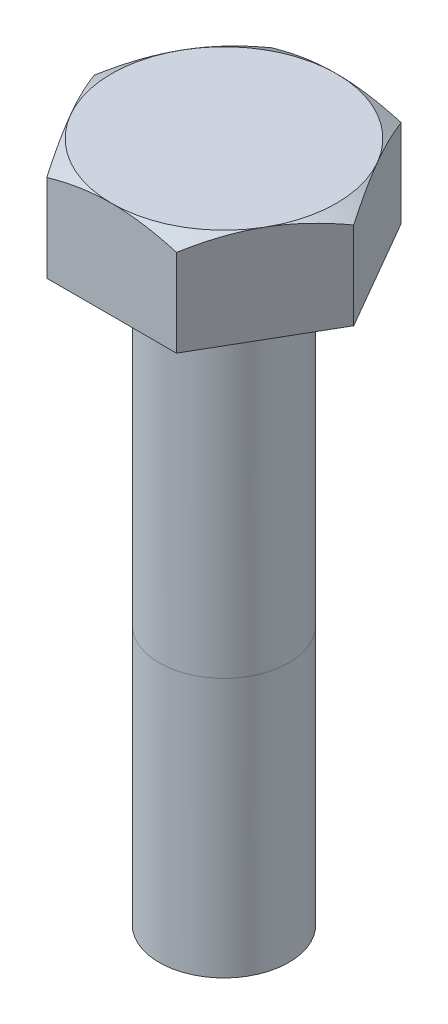
ISO-10303-21;
HEADER;
FILE_DESCRIPTION(('STEP AP214'),'2;1');
FILE_NAME('part.step','',(''),(''),'','','');
FILE_SCHEMA(('AUTOMOTIVE_DESIGN { 1 0 10303 214 1 1 1 1 }'));
ENDSEC;
DATA;
#1=APPLICATION_CONTEXT('core data for automotive mechanical design processes');
#2=APPLICATION_PROTOCOL_DEFINITION('international standard','automotive_design',2000,#1);
#3=PRODUCT_CONTEXT('',#1,'mechanical');
#4=PRODUCT('Part','Part','',(#3));
#5=PRODUCT_RELATED_PRODUCT_CATEGORY('part','',(#4));
#6=PRODUCT_DEFINITION_FORMATION('','',#4);
#7=PRODUCT_DEFINITION_CONTEXT('part definition',#1,'design');
#8=PRODUCT_DEFINITION('design','',#6,#7);
#9=PRODUCT_DEFINITION_SHAPE('','',#8);
#10=(LENGTH_UNIT() NAMED_UNIT(*) SI_UNIT(.MILLI.,.METRE.));
#11=(NAMED_UNIT(*) PLANE_ANGLE_UNIT() SI_UNIT($,.RADIAN.));
#12=(NAMED_UNIT(*) SI_UNIT($,.STERADIAN.) SOLID_ANGLE_UNIT());
#13=UNCERTAINTY_MEASURE_WITH_UNIT(LENGTH_MEASURE(1.E-05),#10,'distance_accuracy_value','');
#14=(GEOMETRIC_REPRESENTATION_CONTEXT(3) GLOBAL_UNCERTAINTY_ASSIGNED_CONTEXT((#13)) GLOBAL_UNIT_ASSIGNED_CONTEXT((#10,
#11,#12)) REPRESENTATION_CONTEXT('',''));
#15=CARTESIAN_POINT('',(0.,0.,0.));
#16=DIRECTION('',(0.,0.,1.));
#17=DIRECTION('',(1.,0.,0.));
#18=AXIS2_PLACEMENT_3D('',#15,#16,#17);
#19=CARTESIAN_POINT('',(0.,-90.,0.));
#20=DIRECTION('',(0.,1.,0.));
#21=DIRECTION('',(0.,0.,1.));
#22=AXIS2_PLACEMENT_3D('',#19,#20,#21);
#23=CYLINDRICAL_SURFACE('',#22,10.);
#24=CARTESIAN_POINT('',(0.,-90.,0.));
#25=DIRECTION('',(0.,-1.,0.));
#26=DIRECTION('',(0.,0.,-1.));
#27=AXIS2_PLACEMENT_3D('',#24,#25,#26);
#28=CIRCLE('',#27,10.);
#29=CARTESIAN_POINT('',(0.,-90.,-10.));
#30=VERTEX_POINT('',#29);
#31=EDGE_CURVE('E266',#30,#30,#28,.T.);
#32=ORIENTED_EDGE('',*,*,#31,.F.);
#33=EDGE_LOOP('',(#32));
#34=FACE_BOUND('',#33,.T.);
#35=CARTESIAN_POINT('',(0.,-50.,0.));
#36=DIRECTION('',(0.,1.,0.));
#37=DIRECTION('',(0.,0.,1.));
#38=AXIS2_PLACEMENT_3D('',#35,#36,#37);
#39=CIRCLE('',#38,10.);
#40=CARTESIAN_POINT('',(0.,-50.,10.));
#41=VERTEX_POINT('',#40);
#42=CARTESIAN_POINT('',(0.,-50.,-10.));
#43=VERTEX_POINT('',#42);
#44=EDGE_CURVE('E12',#41,#43,#39,.T.);
#45=ORIENTED_EDGE('',*,*,#44,.F.);
#46=EDGE_CURVE('E59',#43,#41,#39,.T.);
#47=ORIENTED_EDGE('',*,*,#46,.F.);
#48=EDGE_LOOP('',(#45,#47));
#49=FACE_BOUND('',#48,.T.);
#50=ADVANCED_FACE('F54',(#34,#49),#23,.T.);
#51=CARTESIAN_POINT('',(-10.,15.,17.3205080756888));
#52=DIRECTION('',(0.,0.,-1.));
#53=DIRECTION('',(-1.,0.,0.));
#54=AXIS2_PLACEMENT_3D('',#51,#52,#53);
#55=PLANE('',#54);
#56=CARTESIAN_POINT('',(-35.0002,2.45364774484949,17.3205080756888));
#57=CARTESIAN_POINT('',(-34.594137349599,2.66376511648012,17.3205080756888));
#58=CARTESIAN_POINT('',(-34.187782903959,2.87331841227193,17.3205080756888));
#59=CARTESIAN_POINT('',(-33.3744338694678,3.29118176038433,17.3205080756888));
#60=CARTESIAN_POINT('',(-32.9674392787615,3.49949180909377,17.3205080756888));
#61=CARTESIAN_POINT('',(-31.7453787417217,4.12240059131,17.3205080756888));
#62=CARTESIAN_POINT('',(-30.9292711669501,4.53495975451478,17.3205080756888));
#63=CARTESIAN_POINT('',(-29.2924702097003,5.35411848321641,17.3205080756888));
#64=CARTESIAN_POINT('',(-28.4717716511968,5.76070771838812,17.3205080756888));
#65=CARTESIAN_POINT('',(-26.8264017657733,6.56574726105629,17.3205080756888));
#66=CARTESIAN_POINT('',(-26.0017304995046,6.9641976923242,17.3205080756888));
#67=CARTESIAN_POINT('',(-24.3029908307602,7.77220294530385,17.3205080756888));
#68=CARTESIAN_POINT('',(-23.4286557376069,8.18119873425596,17.3205080756888));
#69=CARTESIAN_POINT('',(-21.6733855750682,8.98490551474932,17.3205080756888));
#70=CARTESIAN_POINT('',(-20.792450242979,9.37961593401695,17.3205080756888));
#71=CARTESIAN_POINT('',(-19.02295102819,10.1503650365485,17.3205080756888));
#72=CARTESIAN_POINT('',(-18.1343914849558,10.5264136090854,17.3205080756888));
#73=CARTESIAN_POINT('',(-16.79417061314,11.072276745268,17.3205080756888));
#74=CARTESIAN_POINT('',(-16.3462126010611,11.2511914561773,17.3205080756888));
#75=CARTESIAN_POINT('',(-15.4475674642222,11.6020195940876,17.3205080756888));
#76=CARTESIAN_POINT('',(-14.9968803941125,11.7739331607596,17.3205080756888));
#77=CARTESIAN_POINT('',(-14.0262783668963,12.1342982457444,17.3205080756888));
#78=CARTESIAN_POINT('',(-13.5058917294667,12.3214842972691,17.3205080756888));
#79=CARTESIAN_POINT('',(-12.4608100305044,12.6833855084323,17.3205080756888));
#80=CARTESIAN_POINT('',(-11.9361151665267,12.8581012363795,17.3205080756888));
#81=CARTESIAN_POINT('',(-10.881940858743,13.19289961425,17.3205080756888));
#82=CARTESIAN_POINT('',(-10.3524604922482,13.3529793731045,17.3205080756888));
#83=CARTESIAN_POINT('',(-9.28857134004602,13.6559344452437,17.3205080756888));
#84=CARTESIAN_POINT('',(-8.75416256248742,13.7988097869689,17.3205080756888));
#85=CARTESIAN_POINT('',(-7.69096618917046,14.0619176794332,17.3205080756888));
#86=CARTESIAN_POINT('',(-7.16227614867952,14.1825418275068,17.3205080756888));
#87=CARTESIAN_POINT('',(-6.10035716875704,14.40175176735,17.3205080756888));
#88=CARTESIAN_POINT('',(-5.5671286312236,14.5003394898638,17.3205080756888));
#89=CARTESIAN_POINT('',(-4.49688553377998,14.6727197767652,17.3205080756888));
#90=CARTESIAN_POINT('',(-3.95987277720629,14.7465234306242,17.3205080756888));
#91=CARTESIAN_POINT('',(-2.88279091983585,14.8670264413517,17.3205080756888));
#92=CARTESIAN_POINT('',(-2.34272186311566,14.9137261880997,17.3205080756888));
#93=CARTESIAN_POINT('',(-1.25267123056077,14.9788391289617,17.3205080756888));
#94=CARTESIAN_POINT('',(-0.702663140287673,14.9968144392807,17.3205080756888));
#95=CARTESIAN_POINT('',(0.39750822446066,15.0024095797508,17.3205080756888));
#96=CARTESIAN_POINT('',(0.947671498865498,14.9900294236495,17.3205080756888));
#97=CARTESIAN_POINT('',(2.04662194168171,14.935394673549,17.3205080756888));
#98=CARTESIAN_POINT('',(2.59540876468069,14.8931332126705,17.3205080756888));
#99=CARTESIAN_POINT('',(3.69004562597623,14.7803083239967,17.3205080756888));
#100=CARTESIAN_POINT('',(4.23589558916494,14.7097441758365,17.3205080756888));
#101=CARTESIAN_POINT('',(5.33479772199172,14.5409743216882,17.3205080756888));
#102=CARTESIAN_POINT('',(5.88776614189482,14.4422283712493,17.3205080756888));
#103=CARTESIAN_POINT('',(6.9888852153133,14.2207291115165,17.3205080756888));
#104=CARTESIAN_POINT('',(7.53703538726093,14.0979734304091,17.3205080756888));
#105=CARTESIAN_POINT('',(8.62832434164041,13.8315420945678,17.3205080756888));
#106=CARTESIAN_POINT('',(9.17146192722064,13.6878615743652,17.3205080756888));
#107=CARTESIAN_POINT('',(10.2526435291594,13.3825660151799,17.3205080756888));
#108=CARTESIAN_POINT('',(10.7906875240284,13.2209509005689,17.3205080756888));
#109=CARTESIAN_POINT('',(11.8578440716817,12.8837498967987,17.3205080756888));
#110=CARTESIAN_POINT('',(12.3869934445496,12.7082799323714,17.3205080756888));
#111=CARTESIAN_POINT('',(13.4408989961677,12.3445757559174,17.3205080756888));
#112=CARTESIAN_POINT('',(13.9656549531212,12.1563409037833,17.3205080756888));
#113=CARTESIAN_POINT('',(15.0112683729156,11.7690093049255,17.3205080756888));
#114=CARTESIAN_POINT('',(15.5321248992447,11.5699100384471,17.3205080756888));
#115=CARTESIAN_POINT('',(16.5702139767911,11.1625258281298,17.3205080756888));
#116=CARTESIAN_POINT('',(17.0874465851673,10.9542410295517,17.3205080756888));
#117=CARTESIAN_POINT('',(18.1193191268702,10.5295860637052,17.3205080756888));
#118=CARTESIAN_POINT('',(18.633955087633,10.3132062644857,17.3205080756888));
#119=CARTESIAN_POINT('',(19.6603532363293,9.87374262244933,17.3205080756888));
#120=CARTESIAN_POINT('',(20.1721154154588,9.65065875910729,17.3205080756888));
#121=CARTESIAN_POINT('',(21.1930219711227,9.19876826058183,17.3205080756888));
#122=CARTESIAN_POINT('',(21.7021666866254,8.96996239013087,17.3205080756888));
#123=CARTESIAN_POINT('',(22.7181974089433,8.50738526628483,17.3205080756888));
#124=CARTESIAN_POINT('',(23.2250833956179,8.27361396872093,17.3205080756888));
#125=CARTESIAN_POINT('',(24.6826194303235,7.59390796966616,17.3205080756888));
#126=CARTESIAN_POINT('',(25.630732791128,7.14253156179619,17.3205080756888));
#127=CARTESIAN_POINT('',(27.5213135261769,6.22806300245096,17.3205080756888));
#128=CARTESIAN_POINT('',(28.4637806901993,5.76497041806496,17.3205080756888));
#129=CARTESIAN_POINT('',(30.3407180245029,4.83126890722638,17.3205080756888));
#130=CARTESIAN_POINT('',(31.2752048003643,4.36069332298709,17.3205080756888));
#131=CARTESIAN_POINT('',(32.674099972078,3.64936975908292,17.3205080756888));
#132=CARTESIAN_POINT('',(33.1399056353817,3.41136235960626,17.3205080756888));
#133=CARTESIAN_POINT('',(34.070667933341,2.93369825038577,17.3205080756888));
#134=CARTESIAN_POINT('',(34.5356245719401,2.69404154832733,17.3205080756888));
#135=CARTESIAN_POINT('',(35.0002,2.45364774484949,17.3205080756888));
#136=B_SPLINE_CURVE_WITH_KNOTS('',3,(#56,#57,#58,#59,#60,#61,#62,#63,#64,#65,#66,#67,#68,#69,
#70,#71,#72,#73,#74,#75,#76,#77,#78,#79,#80,#81,#82,#83,#84,#85,#86,#87,#88,#89,#90,#91,#92,#93,
#94,#95,#96,#97,#98,#99,#100,#101,#102,#103,#104,#105,#106,#107,#108,#109,#110,#111,#112,#113,
#114,#115,#116,#117,#118,#119,#120,#121,#122,#123,#124,#125,#126,#127,#128,#129,#130,#131,#132,
#133,#134,#135),.UNSPECIFIED.,.F.,.F.,(4,2,2,2,2,2,2,2,2,2,2,2,2,2,2,2,2,2,2,2,2,2,2,2,2,2,2,2,
2,2,2,2,2,2,2,2,2,2,2,4),(0.,1.37161344579354,2.74323087365181,5.4865844470669,8.23422875979912,
10.9818312563728,13.8775275628596,16.7733397431781,19.6676006216986,21.1146507212927,
22.5616719384504,24.2206229328047,25.8794982756246,27.5387005942374,29.1979001699968,
30.8243176182081,32.4505925102536,34.0761387635025,35.7016616333065,37.3517358560537,
39.0018093315062,40.6522621257284,42.3027569302302,43.9873035112169,45.6720165851215,
47.3571220178305,49.042234556723,50.7144979923092,52.3868453472154,54.0595822274557,
55.7322926643706,57.4070609905288,59.0818344446946,60.7563852531483,62.43095096343,
65.5810612708419,68.7312881447791,71.8700925066505,73.4393579802908,75.0086161464313),.UNSPECIFIED.);
#137=CARTESIAN_POINT('',(-10.,13.4529946162075,17.3205080756888));
#138=VERTEX_POINT('',#137);
#139=CARTESIAN_POINT('',(0.,15.,17.3205080756888));
#140=VERTEX_POINT('',#139);
#141=EDGE_CURVE('E334',#138,#140,#136,.T.);
#142=ORIENTED_EDGE('',*,*,#141,.F.);
#143=DIRECTION('',(0.,-1.,0.));
#144=VECTOR('',#143,1.);
#145=CARTESIAN_POINT('',(-10.,15.,17.3205080756888));
#146=LINE('',#145,#144);
#147=CARTESIAN_POINT('',(-10.,0.,17.3205080756888));
#148=VERTEX_POINT('',#147);
#149=EDGE_CURVE('E290',#138,#148,#146,.T.);
#150=ORIENTED_EDGE('',*,*,#149,.T.);
#151=DIRECTION('',(1.,0.,0.));
#152=VECTOR('',#151,1.);
#153=CARTESIAN_POINT('',(-10.,0.,17.3205080756888));
#154=LINE('',#153,#152);
#155=CARTESIAN_POINT('',(10.,0.,17.3205080756888));
#156=VERTEX_POINT('',#155);
#157=EDGE_CURVE('E267',#148,#156,#154,.T.);
#158=ORIENTED_EDGE('',*,*,#157,.T.);
#159=DIRECTION('',(0.,-1.,0.));
#160=VECTOR('',#159,1.);
#161=CARTESIAN_POINT('',(10.,15.,17.3205080756888));
#162=LINE('',#161,#160);
#163=CARTESIAN_POINT('',(10.,13.4529946162075,17.3205080756888));
#164=VERTEX_POINT('',#163);
#165=EDGE_CURVE('E259',#164,#156,#162,.T.);
#166=ORIENTED_EDGE('',*,*,#165,.F.);
#167=EDGE_CURVE('E134',#140,#164,#136,.T.);
#168=ORIENTED_EDGE('',*,*,#167,.F.);
#169=EDGE_LOOP('',(#142,#150,#158,#166,#168));
#170=FACE_BOUND('',#169,.T.);
#171=ADVANCED_FACE('F56',(#170),#55,.F.);
#172=CARTESIAN_POINT('',(10.,15.,17.3205080756888));
#173=DIRECTION('',(-0.866025403784439,0.,-0.5));
#174=DIRECTION('',(-0.5,0.,0.866025403784439));
#175=AXIS2_PLACEMENT_3D('',#172,#173,#174);
#176=PLANE('',#175);
#177=CARTESIAN_POINT('',(9.99988452994616,13.4529279489635,17.3207080756888));
#178=CARTESIAN_POINT('',(10.2196804489893,13.5798185342334,16.9400103766098));
#179=CARTESIAN_POINT('',(10.4403336901135,13.7009510337884,16.5578277521278));
#180=CARTESIAN_POINT('',(10.8834095498801,13.930099316246,15.7903978514049));
#181=CARTESIAN_POINT('',(11.1058327249843,14.0381107850942,15.4051496113436));
#182=CARTESIAN_POINT('',(11.5528783285174,14.2395651135495,14.630843912724));
#183=CARTESIAN_POINT('',(11.7775046690377,14.3329735022134,14.2417796782245));
#184=CARTESIAN_POINT('',(12.2283181757897,14.5032158841818,13.4609477797918));
#185=CARTESIAN_POINT('',(12.4545052518665,14.5800508267049,13.0691802720113));
#186=CARTESIAN_POINT('',(12.9026445477568,14.7138783019843,12.2929802426613));
#187=CARTESIAN_POINT('',(13.1245634977723,14.7713137797107,11.908605346072));
#188=CARTESIAN_POINT('',(13.5694182641675,14.8676202170631,11.1380942886863));
#189=CARTESIAN_POINT('',(13.792354100037,14.9064908193503,10.7519580941326));
#190=CARTESIAN_POINT('',(14.238600264853,14.9646860457402,9.97903706398849));
#191=CARTESIAN_POINT('',(14.4619098314385,14.9840338963199,9.59225354884623));
#192=CARTESIAN_POINT('',(14.9087350891726,15.0027675315602,8.81832950034572));
#193=CARTESIAN_POINT('',(15.1322507737385,15.0021539330448,8.43118897838892));
#194=CARTESIAN_POINT('',(15.5501187845552,14.9823587382273,7.70742035279679));
#195=CARTESIAN_POINT('',(15.7445008833177,14.9655909890474,7.37074068165826));
#196=CARTESIAN_POINT('',(16.1328014051118,14.9172765485596,6.69818444930523));
#197=CARTESIAN_POINT('',(16.326719834744,14.885730068907,6.36230787665832));
#198=CARTESIAN_POINT('',(16.7140195476725,14.8084055580043,5.6914850961094));
#199=CARTESIAN_POINT('',(16.9074001850312,14.7626146571441,5.35654000700406));
#200=CARTESIAN_POINT('',(17.2932408832781,14.657609335493,4.68824431401259));
#201=CARTESIAN_POINT('',(17.4857009480636,14.5983949715832,4.35489370337606));
#202=CARTESIAN_POINT('',(18.0699383096197,14.3991106794132,3.34296490948102));
#203=CARTESIAN_POINT('',(18.4600237115261,14.2391695069504,2.66731717408817));
#204=CARTESIAN_POINT('',(19.2343779336769,13.8761686704497,1.32609631826738));
#205=CARTESIAN_POINT('',(19.6186566679131,13.6731942560017,0.660506026302148));
#206=CARTESIAN_POINT('',(20.0001154700538,13.4529279489635,-0.000200000000003042));
#207=B_SPLINE_CURVE_WITH_KNOTS('',3,(#177,#178,#179,#180,#181,#182,#183,#184,#185,#186,#187,
#188,#189,#190,#191,#192,#193,#194,#195,#196,#197,#198,#199,#200,#201,#202,#203,#204,#205,#206),
.UNSPECIFIED.,.F.,.F.,(4,2,2,2,2,2,2,2,2,2,2,2,2,2,4),(0.,1.3726537943407,2.74575768798322,
4.12205542001801,5.49827430578548,6.84052513875048,8.182801806464,9.52347966022142,
10.8641160860469,12.0312115970818,13.1982903939407,14.3664267057211,15.53455806769,
17.9222758503161,20.3053069971282),.UNSPECIFIED.);
#208=CARTESIAN_POINT('',(15.,15.,8.66025403784438));
#209=VERTEX_POINT('',#208);
#210=EDGE_CURVE('E127',#164,#209,#207,.T.);
#211=ORIENTED_EDGE('',*,*,#210,.F.);
#212=ORIENTED_EDGE('',*,*,#165,.T.);
#213=DIRECTION('',(0.5,0.,-0.866025403784439));
#214=VECTOR('',#213,1.);
#215=CARTESIAN_POINT('',(10.,0.,17.3205080756888));
#216=LINE('',#215,#214);
#217=CARTESIAN_POINT('',(20.,0.,0.));
#218=VERTEX_POINT('',#217);
#219=EDGE_CURVE('E271',#156,#218,#216,.T.);
#220=ORIENTED_EDGE('',*,*,#219,.T.);
#221=DIRECTION('',(0.,-1.,0.));
#222=VECTOR('',#221,1.);
#223=CARTESIAN_POINT('',(20.,15.,0.));
#224=LINE('',#223,#222);
#225=CARTESIAN_POINT('',(20.,13.4529946162075,0.));
#226=VERTEX_POINT('',#225);
#227=EDGE_CURVE('E163',#226,#218,#224,.T.);
#228=ORIENTED_EDGE('',*,*,#227,.F.);
#229=EDGE_CURVE('E139',#209,#226,#207,.T.);
#230=ORIENTED_EDGE('',*,*,#229,.F.);
#231=EDGE_LOOP('',(#211,#212,#220,#228,#230));
#232=FACE_BOUND('',#231,.T.);
#233=ADVANCED_FACE('F161',(#232),#176,.F.);
#234=CARTESIAN_POINT('',(20.,15.,0.));
#235=DIRECTION('',(-0.866025403784439,0.,0.5));
#236=DIRECTION('',(0.5,0.,0.866025403784439));
#237=AXIS2_PLACEMENT_3D('',#234,#235,#236);
#238=PLANE('',#237);
#239=CARTESIAN_POINT('',(20.0001154700538,13.4529279489635,0.000199999999995952));
#240=CARTESIAN_POINT('',(19.7803195510107,13.5798185342334,-0.380497699078995));
#241=CARTESIAN_POINT('',(19.5596663098865,13.7009510337884,-0.762680323560921));
#242=CARTESIAN_POINT('',(19.1165904501199,13.930099316246,-1.53011022428389));
#243=CARTESIAN_POINT('',(18.8941672750157,14.0381107850942,-1.91535846434513));
#244=CARTESIAN_POINT('',(18.4471216714826,14.2395651135495,-2.68966416296479));
#245=CARTESIAN_POINT('',(18.2224953309622,14.3329735022134,-3.07872839746427));
#246=CARTESIAN_POINT('',(17.7716818242103,14.5032158841818,-3.85956029589702));
#247=CARTESIAN_POINT('',(17.5454947481335,14.5800508267049,-4.2513278036775));
#248=CARTESIAN_POINT('',(17.0973554522432,14.7138783019843,-5.0275278330275));
#249=CARTESIAN_POINT('',(16.8754365022277,14.7713137797107,-5.41190272961675));
#250=CARTESIAN_POINT('',(16.4305817358325,14.8676202170631,-6.18241378700246));
#251=CARTESIAN_POINT('',(16.207645899963,14.9064908193503,-6.56854998155616));
#252=CARTESIAN_POINT('',(15.761399735147,14.9646860457402,-7.34147101170028));
#253=CARTESIAN_POINT('',(15.5380901685615,14.9840338963199,-7.72825452684254));
#254=CARTESIAN_POINT('',(15.0912649108274,15.0027675315602,-8.50217857534305));
#255=CARTESIAN_POINT('',(14.8677492262614,15.0021539330448,-8.88931909729985));
#256=CARTESIAN_POINT('',(14.4498812154448,14.9823587382273,-9.61308772289197));
#257=CARTESIAN_POINT('',(14.2554991166823,14.9655909890474,-9.94976739403051));
#258=CARTESIAN_POINT('',(13.8671985948881,14.9172765485596,-10.6223236263835));
#259=CARTESIAN_POINT('',(13.673280165256,14.885730068907,-10.9582001990304));
#260=CARTESIAN_POINT('',(13.2859804523275,14.8084055580043,-11.6290229795794));
#261=CARTESIAN_POINT('',(13.0925998149688,14.7626146571441,-11.9639680686847));
#262=CARTESIAN_POINT('',(12.7067591167219,14.657609335493,-12.6322637616762));
#263=CARTESIAN_POINT('',(12.5142990519364,14.5983949715832,-12.9656143723127));
#264=CARTESIAN_POINT('',(11.9300616903803,14.3991106794132,-13.9775431662077));
#265=CARTESIAN_POINT('',(11.5399762884739,14.2391695069504,-14.6531909016006));
#266=CARTESIAN_POINT('',(10.765622066323,13.8761686704497,-15.9944117574214));
#267=CARTESIAN_POINT('',(10.3813433320869,13.6731942560016,-16.6600020493866));
#268=CARTESIAN_POINT('',(9.99988452994616,13.4529279489635,-17.3207080756888));
#269=B_SPLINE_CURVE_WITH_KNOTS('',3,(#239,#240,#241,#242,#243,#244,#245,#246,#247,#248,#249,
#250,#251,#252,#253,#254,#255,#256,#257,#258,#259,#260,#261,#262,#263,#264,#265,#266,#267,#268),
.UNSPECIFIED.,.F.,.F.,(4,2,2,2,2,2,2,2,2,2,2,2,2,2,4),(0.,1.37265379434071,2.74575768798323,
4.12205542001802,5.49827430578548,6.84052513875048,8.182801806464,9.52347966022142,
10.8641160860469,12.0312115970818,13.1982903939407,14.3664267057211,15.53455806769,
17.9222758503161,20.3053069971282),.UNSPECIFIED.);
#270=CARTESIAN_POINT('',(15.,15.,-8.66025403784438));
#271=VERTEX_POINT('',#270);
#272=EDGE_CURVE('E146',#226,#271,#269,.T.);
#273=ORIENTED_EDGE('',*,*,#272,.F.);
#274=ORIENTED_EDGE('',*,*,#227,.T.);
#275=DIRECTION('',(-0.5,0.,-0.866025403784439));
#276=VECTOR('',#275,1.);
#277=CARTESIAN_POINT('',(20.,0.,0.));
#278=LINE('',#277,#276);
#279=CARTESIAN_POINT('',(10.,0.,-17.3205080756888));
#280=VERTEX_POINT('',#279);
#281=EDGE_CURVE('E274',#218,#280,#278,.T.);
#282=ORIENTED_EDGE('',*,*,#281,.T.);
#283=DIRECTION('',(0.,-1.,0.));
#284=VECTOR('',#283,1.);
#285=CARTESIAN_POINT('',(10.,15.,-17.3205080756888));
#286=LINE('',#285,#284);
#287=CARTESIAN_POINT('',(10.,13.4529946162075,-17.3205080756888));
#288=VERTEX_POINT('',#287);
#289=EDGE_CURVE('E299',#288,#280,#286,.T.);
#290=ORIENTED_EDGE('',*,*,#289,.F.);
#291=EDGE_CURVE('E166',#271,#288,#269,.T.);
#292=ORIENTED_EDGE('',*,*,#291,.F.);
#293=EDGE_LOOP('',(#273,#274,#282,#290,#292));
#294=FACE_BOUND('',#293,.T.);
#295=ADVANCED_FACE('F225',(#294),#238,.F.);
#296=CARTESIAN_POINT('',(10.,15.,-17.3205080756888));
#297=DIRECTION('',(0.,0.,1.));
#298=DIRECTION('',(1.,0.,0.));
#299=AXIS2_PLACEMENT_3D('',#296,#297,#298);
#300=PLANE('',#299);
#301=CARTESIAN_POINT('',(35.0002,2.45364774484949,-17.3205080756888));
#302=CARTESIAN_POINT('',(34.594137349599,2.66376511648011,-17.3205080756888));
#303=CARTESIAN_POINT('',(34.187782903959,2.87331841227192,-17.3205080756888));
#304=CARTESIAN_POINT('',(33.3744338694678,3.29118176038433,-17.3205080756888));
#305=CARTESIAN_POINT('',(32.9674392787615,3.49949180909377,-17.3205080756888));
#306=CARTESIAN_POINT('',(31.7453787417217,4.12240059131,-17.3205080756888));
#307=CARTESIAN_POINT('',(30.9292711669501,4.53495975451479,-17.3205080756888));
#308=CARTESIAN_POINT('',(29.2924702097003,5.35411848321641,-17.3205080756888));
#309=CARTESIAN_POINT('',(28.4717716511968,5.76070771838812,-17.3205080756888));
#310=CARTESIAN_POINT('',(26.8264017657733,6.56574726105629,-17.3205080756888));
#311=CARTESIAN_POINT('',(26.0017304995046,6.9641976923242,-17.3205080756888));
#312=CARTESIAN_POINT('',(24.3029908307602,7.77220294530385,-17.3205080756888));
#313=CARTESIAN_POINT('',(23.4286557376069,8.18119873425596,-17.3205080756888));
#314=CARTESIAN_POINT('',(21.6733855750682,8.98490551474932,-17.3205080756888));
#315=CARTESIAN_POINT('',(20.792450242979,9.37961593401695,-17.3205080756888));
#316=CARTESIAN_POINT('',(19.02295102819,10.1503650365485,-17.3205080756888));
#317=CARTESIAN_POINT('',(18.1343914849558,10.5264136090854,-17.3205080756888));
#318=CARTESIAN_POINT('',(16.79417061314,11.072276745268,-17.3205080756888));
#319=CARTESIAN_POINT('',(16.3462126010611,11.2511914561773,-17.3205080756888));
#320=CARTESIAN_POINT('',(15.4475674642222,11.6020195940876,-17.3205080756888));
#321=CARTESIAN_POINT('',(14.9968803941125,11.7739331607596,-17.3205080756888));
#322=CARTESIAN_POINT('',(14.0262783668963,12.1342982457444,-17.3205080756888));
#323=CARTESIAN_POINT('',(13.5058917294667,12.3214842972691,-17.3205080756888));
#324=CARTESIAN_POINT('',(12.4608100305044,12.6833855084323,-17.3205080756888));
#325=CARTESIAN_POINT('',(11.9361151665267,12.8581012363795,-17.3205080756888));
#326=CARTESIAN_POINT('',(10.881940858743,13.19289961425,-17.3205080756888));
#327=CARTESIAN_POINT('',(10.3524604922481,13.3529793731045,-17.3205080756888));
#328=CARTESIAN_POINT('',(9.28857134004601,13.6559344452437,-17.3205080756888));
#329=CARTESIAN_POINT('',(8.75416256248742,13.7988097869689,-17.3205080756888));
#330=CARTESIAN_POINT('',(7.69096618917046,14.0619176794332,-17.3205080756888));
#331=CARTESIAN_POINT('',(7.16227614867952,14.1825418275068,-17.3205080756888));
#332=CARTESIAN_POINT('',(6.10035716875704,14.40175176735,-17.3205080756888));
#333=CARTESIAN_POINT('',(5.5671286312236,14.5003394898638,-17.3205080756888));
#334=CARTESIAN_POINT('',(4.49688553377998,14.6727197767652,-17.3205080756888));
#335=CARTESIAN_POINT('',(3.95987277720629,14.7465234306242,-17.3205080756888));
#336=CARTESIAN_POINT('',(2.88279091983585,14.8670264413517,-17.3205080756888));
#337=CARTESIAN_POINT('',(2.34272186311566,14.9137261880997,-17.3205080756888));
#338=CARTESIAN_POINT('',(1.25267123056078,14.9788391289617,-17.3205080756888));
#339=CARTESIAN_POINT('',(0.702663140287677,14.9968144392807,-17.3205080756888));
#340=CARTESIAN_POINT('',(-0.397508224460655,15.0024095797508,-17.3205080756888));
#341=CARTESIAN_POINT('',(-0.947671498865495,14.9900294236495,-17.3205080756888));
#342=CARTESIAN_POINT('',(-2.04662194168171,14.935394673549,-17.3205080756888));
#343=CARTESIAN_POINT('',(-2.59540876468069,14.8931332126705,-17.3205080756888));
#344=CARTESIAN_POINT('',(-3.69004562597623,14.7803083239967,-17.3205080756888));
#345=CARTESIAN_POINT('',(-4.23589558916494,14.7097441758365,-17.3205080756888));
#346=CARTESIAN_POINT('',(-5.33479772199171,14.5409743216882,-17.3205080756888));
#347=CARTESIAN_POINT('',(-5.88776614189481,14.4422283712493,-17.3205080756888));
#348=CARTESIAN_POINT('',(-6.98888521531329,14.2207291115165,-17.3205080756888));
#349=CARTESIAN_POINT('',(-7.53703538726093,14.0979734304091,-17.3205080756888));
#350=CARTESIAN_POINT('',(-8.62832434164041,13.8315420945678,-17.3205080756888));
#351=CARTESIAN_POINT('',(-9.17146192722064,13.6878615743652,-17.3205080756888));
#352=CARTESIAN_POINT('',(-10.2526435291594,13.3825660151799,-17.3205080756888));
#353=CARTESIAN_POINT('',(-10.7906875240284,13.2209509005689,-17.3205080756888));
#354=CARTESIAN_POINT('',(-11.8578440716817,12.8837498967987,-17.3205080756888));
#355=CARTESIAN_POINT('',(-12.3869934445496,12.7082799323714,-17.3205080756888));
#356=CARTESIAN_POINT('',(-13.4408989961677,12.3445757559174,-17.3205080756888));
#357=CARTESIAN_POINT('',(-13.9656549531212,12.1563409037833,-17.3205080756888));
#358=CARTESIAN_POINT('',(-15.0112683729156,11.7690093049255,-17.3205080756888));
#359=CARTESIAN_POINT('',(-15.5321248992447,11.5699100384471,-17.3205080756888));
#360=CARTESIAN_POINT('',(-16.5702139767911,11.1625258281298,-17.3205080756888));
#361=CARTESIAN_POINT('',(-17.0874465851673,10.9542410295517,-17.3205080756888));
#362=CARTESIAN_POINT('',(-18.1193191268702,10.5295860637052,-17.3205080756888));
#363=CARTESIAN_POINT('',(-18.633955087633,10.3132062644857,-17.3205080756888));
#364=CARTESIAN_POINT('',(-19.6603532363293,9.87374262244933,-17.3205080756888));
#365=CARTESIAN_POINT('',(-20.1721154154588,9.65065875910728,-17.3205080756888));
#366=CARTESIAN_POINT('',(-21.1930219711227,9.19876826058182,-17.3205080756888));
#367=CARTESIAN_POINT('',(-21.7021666866254,8.96996239013086,-17.3205080756888));
#368=CARTESIAN_POINT('',(-22.7181974089433,8.50738526628483,-17.3205080756888));
#369=CARTESIAN_POINT('',(-23.2250833956179,8.27361396872093,-17.3205080756888));
#370=CARTESIAN_POINT('',(-24.6826194303235,7.59390796966615,-17.3205080756888));
#371=CARTESIAN_POINT('',(-25.630732791128,7.14253156179619,-17.3205080756888));
#372=CARTESIAN_POINT('',(-27.5213135261769,6.22806300245096,-17.3205080756888));
#373=CARTESIAN_POINT('',(-28.4637806901993,5.76497041806496,-17.3205080756888));
#374=CARTESIAN_POINT('',(-30.3407180245029,4.83126890722638,-17.3205080756888));
#375=CARTESIAN_POINT('',(-31.2752048003643,4.36069332298709,-17.3205080756888));
#376=CARTESIAN_POINT('',(-32.674099972078,3.64936975908292,-17.3205080756888));
#377=CARTESIAN_POINT('',(-33.1399056353817,3.41136235960626,-17.3205080756888));
#378=CARTESIAN_POINT('',(-34.070667933341,2.93369825038577,-17.3205080756888));
#379=CARTESIAN_POINT('',(-34.5356245719401,2.69404154832733,-17.3205080756888));
#380=CARTESIAN_POINT('',(-35.0002,2.45364774484949,-17.3205080756888));
#381=B_SPLINE_CURVE_WITH_KNOTS('',3,(#301,#302,#303,#304,#305,#306,#307,#308,#309,#310,#311,
#312,#313,#314,#315,#316,#317,#318,#319,#320,#321,#322,#323,#324,#325,#326,#327,#328,#329,#330,
#331,#332,#333,#334,#335,#336,#337,#338,#339,#340,#341,#342,#343,#344,#345,#346,#347,#348,#349,
#350,#351,#352,#353,#354,#355,#356,#357,#358,#359,#360,#361,#362,#363,#364,#365,#366,#367,#368,
#369,#370,#371,#372,#373,#374,#375,#376,#377,#378,#379,#380),.UNSPECIFIED.,.F.,.F.,(4,2,2,2,2,2,
2,2,2,2,2,2,2,2,2,2,2,2,2,2,2,2,2,2,2,2,2,2,2,2,2,2,2,2,2,2,2,2,2,4),(0.,1.37161344579354,
2.74323087365181,5.4865844470669,8.23422875979912,10.9818312563728,13.8775275628596,
16.7733397431781,19.6676006216986,21.1146507212927,22.5616719384504,24.2206229328047,
25.8794982756246,27.5387005942374,29.1979001699968,30.8243176182081,32.4505925102536,
34.0761387635025,35.7016616333065,37.3517358560537,39.0018093315062,40.6522621257284,
42.3027569302302,43.9873035112169,45.6720165851215,47.3571220178305,49.042234556723,
50.7144979923092,52.3868453472154,54.0595822274557,55.7322926643706,57.4070609905288,
59.0818344446946,60.7563852531483,62.43095096343,65.5810612708419,68.7312881447791,
71.8700925066505,73.4393579802908,75.0086161464313),.UNSPECIFIED.);
#382=CARTESIAN_POINT('',(0.,15.,-17.3205080756888));
#383=VERTEX_POINT('',#382);
#384=EDGE_CURVE('E219',#288,#383,#381,.T.);
#385=ORIENTED_EDGE('',*,*,#384,.F.);
#386=ORIENTED_EDGE('',*,*,#289,.T.);
#387=DIRECTION('',(-1.,0.,0.));
#388=VECTOR('',#387,1.);
#389=CARTESIAN_POINT('',(10.,0.,-17.3205080756888));
#390=LINE('',#389,#388);
#391=CARTESIAN_POINT('',(-10.,0.,-17.3205080756888));
#392=VERTEX_POINT('',#391);
#393=EDGE_CURVE('E278',#280,#392,#390,.T.);
#394=ORIENTED_EDGE('',*,*,#393,.T.);
#395=DIRECTION('',(0.,-1.,0.));
#396=VECTOR('',#395,1.);
#397=CARTESIAN_POINT('',(-10.,15.,-17.3205080756888));
#398=LINE('',#397,#396);
#399=CARTESIAN_POINT('',(-10.,13.4529946162075,-17.3205080756888));
#400=VERTEX_POINT('',#399);
#401=EDGE_CURVE('E296',#400,#392,#398,.T.);
#402=ORIENTED_EDGE('',*,*,#401,.F.);
#403=EDGE_CURVE('E212',#383,#400,#381,.T.);
#404=ORIENTED_EDGE('',*,*,#403,.F.);
#405=EDGE_LOOP('',(#385,#386,#394,#402,#404));
#406=FACE_BOUND('',#405,.T.);
#407=ADVANCED_FACE('F221',(#406),#300,.F.);
#408=CARTESIAN_POINT('',(-10.,15.,-17.3205080756888));
#409=DIRECTION('',(0.866025403784439,0.,0.5));
#410=DIRECTION('',(0.5,0.,-0.866025403784439));
#411=AXIS2_PLACEMENT_3D('',#408,#409,#410);
#412=PLANE('',#411);
#413=CARTESIAN_POINT('',(-9.99988452994616,13.4529279489635,-17.3207080756888));
#414=CARTESIAN_POINT('',(-10.2196804489893,13.5798185342334,-16.9400103766098));
#415=CARTESIAN_POINT('',(-10.4403336901135,13.7009510337884,-16.5578277521278));
#416=CARTESIAN_POINT('',(-10.8834095498801,13.930099316246,-15.7903978514049));
#417=CARTESIAN_POINT('',(-11.1058327249843,14.0381107850942,-15.4051496113436));
#418=CARTESIAN_POINT('',(-11.5528783285174,14.2395651135495,-14.630843912724));
#419=CARTESIAN_POINT('',(-11.7775046690377,14.3329735022134,-14.2417796782245));
#420=CARTESIAN_POINT('',(-12.2283181757897,14.5032158841818,-13.4609477797918));
#421=CARTESIAN_POINT('',(-12.4545052518665,14.5800508267048,-13.0691802720113));
#422=CARTESIAN_POINT('',(-12.9026445477568,14.7138783019843,-12.2929802426613));
#423=CARTESIAN_POINT('',(-13.1245634977723,14.7713137797107,-11.908605346072));
#424=CARTESIAN_POINT('',(-13.5694182641675,14.8676202170631,-11.1380942886863));
#425=CARTESIAN_POINT('',(-13.792354100037,14.9064908193503,-10.7519580941326));
#426=CARTESIAN_POINT('',(-14.238600264853,14.9646860457402,-9.97903706398849));
#427=CARTESIAN_POINT('',(-14.4619098314385,14.9840338963199,-9.59225354884623));
#428=CARTESIAN_POINT('',(-14.9087350891726,15.0027675315602,-8.81832950034572));
#429=CARTESIAN_POINT('',(-15.1322507737385,15.0021539330448,-8.43118897838892));
#430=CARTESIAN_POINT('',(-15.5501187845552,14.9823587382273,-7.70742035279679));
#431=CARTESIAN_POINT('',(-15.7445008833177,14.9655909890474,-7.37074068165826));
#432=CARTESIAN_POINT('',(-16.1328014051119,14.9172765485596,-6.69818444930524));
#433=CARTESIAN_POINT('',(-16.326719834744,14.885730068907,-6.36230787665832));
#434=CARTESIAN_POINT('',(-16.7140195476725,14.8084055580043,-5.6914850961094));
#435=CARTESIAN_POINT('',(-16.9074001850312,14.7626146571441,-5.35654000700407));
#436=CARTESIAN_POINT('',(-17.2932408832781,14.657609335493,-4.6882443140126));
#437=CARTESIAN_POINT('',(-17.4857009480636,14.5983949715832,-4.35489370337607));
#438=CARTESIAN_POINT('',(-18.0699383096197,14.3991106794132,-3.34296490948103));
#439=CARTESIAN_POINT('',(-18.4600237115261,14.2391695069504,-2.66731717408818));
#440=CARTESIAN_POINT('',(-19.2343779336769,13.8761686704497,-1.32609631826739));
#441=CARTESIAN_POINT('',(-19.6186566679131,13.6731942560017,-0.660506026302158));
#442=CARTESIAN_POINT('',(-20.0001154700538,13.4529279489635,0.000199999999992543));
#443=B_SPLINE_CURVE_WITH_KNOTS('',3,(#413,#414,#415,#416,#417,#418,#419,#420,#421,#422,#423,
#424,#425,#426,#427,#428,#429,#430,#431,#432,#433,#434,#435,#436,#437,#438,#439,#440,#441,#442),
.UNSPECIFIED.,.F.,.F.,(4,2,2,2,2,2,2,2,2,2,2,2,2,2,4),(0.,1.37265379434071,2.74575768798323,
4.12205542001802,5.49827430578548,6.84052513875048,8.182801806464,9.52347966022142,
10.8641160860469,12.0312115970818,13.1982903939407,14.3664267057211,15.53455806769,
17.9222758503161,20.3053069971282),.UNSPECIFIED.);
#444=CARTESIAN_POINT('',(-15.,15.,-8.66025403784438));
#445=VERTEX_POINT('',#444);
#446=EDGE_CURVE('E220',#400,#445,#443,.T.);
#447=ORIENTED_EDGE('',*,*,#446,.F.);
#448=ORIENTED_EDGE('',*,*,#401,.T.);
#449=DIRECTION('',(-0.5,0.,0.866025403784439));
#450=VECTOR('',#449,1.);
#451=CARTESIAN_POINT('',(-10.,0.,-17.3205080756888));
#452=LINE('',#451,#450);
#453=CARTESIAN_POINT('',(-20.,0.,0.));
#454=VERTEX_POINT('',#453);
#455=EDGE_CURVE('E282',#392,#454,#452,.T.);
#456=ORIENTED_EDGE('',*,*,#455,.T.);
#457=DIRECTION('',(0.,-1.,0.));
#458=VECTOR('',#457,1.);
#459=CARTESIAN_POINT('',(-20.,15.,0.));
#460=LINE('',#459,#458);
#461=CARTESIAN_POINT('',(-20.,13.4529946162075,0.));
#462=VERTEX_POINT('',#461);
#463=EDGE_CURVE('E293',#462,#454,#460,.T.);
#464=ORIENTED_EDGE('',*,*,#463,.F.);
#465=EDGE_CURVE('E206',#445,#462,#443,.T.);
#466=ORIENTED_EDGE('',*,*,#465,.F.);
#467=EDGE_LOOP('',(#447,#448,#456,#464,#466));
#468=FACE_BOUND('',#467,.T.);
#469=ADVANCED_FACE('F224',(#468),#412,.F.);
#470=CARTESIAN_POINT('',(-20.,15.,0.));
#471=DIRECTION('',(0.866025403784439,0.,-0.5));
#472=DIRECTION('',(-0.5,0.,-0.866025403784439));
#473=AXIS2_PLACEMENT_3D('',#470,#471,#472);
#474=PLANE('',#473);
#475=CARTESIAN_POINT('',(-20.0001154700538,13.4529279489635,-0.000200000000005722));
#476=CARTESIAN_POINT('',(-19.7803195510107,13.5798185342334,0.380497699078987));
#477=CARTESIAN_POINT('',(-19.5596663098865,13.7009510337884,0.762680323560913));
#478=CARTESIAN_POINT('',(-19.1165904501199,13.930099316246,1.53011022428388));
#479=CARTESIAN_POINT('',(-18.8941672750157,14.0381107850942,1.91535846434512));
#480=CARTESIAN_POINT('',(-18.4471216714826,14.2395651135495,2.68966416296478));
#481=CARTESIAN_POINT('',(-18.2224953309623,14.3329735022134,3.07872839746426));
#482=CARTESIAN_POINT('',(-17.7716818242103,14.5032158841818,3.85956029589701));
#483=CARTESIAN_POINT('',(-17.5454947481335,14.5800508267048,4.25132780367749));
#484=CARTESIAN_POINT('',(-17.0973554522432,14.7138783019843,5.02752783302749));
#485=CARTESIAN_POINT('',(-16.8754365022277,14.7713137797107,5.41190272961674));
#486=CARTESIAN_POINT('',(-16.4305817358325,14.8676202170631,6.18241378700245));
#487=CARTESIAN_POINT('',(-16.207645899963,14.9064908193503,6.56854998155615));
#488=CARTESIAN_POINT('',(-15.761399735147,14.9646860457402,7.34147101170027));
#489=CARTESIAN_POINT('',(-15.5380901685615,14.9840338963199,7.72825452684253));
#490=CARTESIAN_POINT('',(-15.0912649108274,15.0027675315602,8.50217857534304));
#491=CARTESIAN_POINT('',(-14.8677492262614,15.0021539330448,8.88931909729984));
#492=CARTESIAN_POINT('',(-14.4498812154448,14.9823587382273,9.61308772289197));
#493=CARTESIAN_POINT('',(-14.2554991166823,14.9655909890474,9.9497673940305));
#494=CARTESIAN_POINT('',(-13.8671985948881,14.9172765485596,10.6223236263835));
#495=CARTESIAN_POINT('',(-13.673280165256,14.885730068907,10.9582001990304));
#496=CARTESIAN_POINT('',(-13.2859804523275,14.8084055580043,11.6290229795794));
#497=CARTESIAN_POINT('',(-13.0925998149688,14.7626146571441,11.9639680686847));
#498=CARTESIAN_POINT('',(-12.7067591167219,14.657609335493,12.6322637616762));
#499=CARTESIAN_POINT('',(-12.5142990519364,14.5983949715832,12.9656143723127));
#500=CARTESIAN_POINT('',(-11.9300616903803,14.3991106794132,13.9775431662077));
#501=CARTESIAN_POINT('',(-11.5399762884739,14.2391695069504,14.6531909016006));
#502=CARTESIAN_POINT('',(-10.765622066323,13.8761686704497,15.9944117574214));
#503=CARTESIAN_POINT('',(-10.3813433320869,13.6731942560016,16.6600020493866));
#504=CARTESIAN_POINT('',(-9.99988452994616,13.4529279489635,17.3207080756888));
#505=B_SPLINE_CURVE_WITH_KNOTS('',3,(#475,#476,#477,#478,#479,#480,#481,#482,#483,#484,#485,
#486,#487,#488,#489,#490,#491,#492,#493,#494,#495,#496,#497,#498,#499,#500,#501,#502,#503,#504),
.UNSPECIFIED.,.F.,.F.,(4,2,2,2,2,2,2,2,2,2,2,2,2,2,4),(0.,1.37265379434071,2.74575768798323,
4.12205542001802,5.49827430578548,6.84052513875048,8.182801806464,9.52347966022142,
10.8641160860469,12.0312115970818,13.1982903939407,14.3664267057211,15.53455806769,
17.9222758503161,20.3053069971282),.UNSPECIFIED.);
#506=CARTESIAN_POINT('',(-15.,15.,8.66025403784438));
#507=VERTEX_POINT('',#506);
#508=EDGE_CURVE('E336',#462,#507,#505,.T.);
#509=ORIENTED_EDGE('',*,*,#508,.F.);
#510=ORIENTED_EDGE('',*,*,#463,.T.);
#511=DIRECTION('',(0.5,0.,0.866025403784439));
#512=VECTOR('',#511,1.);
#513=CARTESIAN_POINT('',(-20.,0.,0.));
#514=LINE('',#513,#512);
#515=EDGE_CURVE('E286',#454,#148,#514,.T.);
#516=ORIENTED_EDGE('',*,*,#515,.T.);
#517=ORIENTED_EDGE('',*,*,#149,.F.);
#518=EDGE_CURVE('E158',#507,#138,#505,.T.);
#519=ORIENTED_EDGE('',*,*,#518,.F.);
#520=EDGE_LOOP('',(#509,#510,#516,#517,#519));
#521=FACE_BOUND('',#520,.T.);
#522=ADVANCED_FACE('F251',(#521),#474,.F.);
#523=CARTESIAN_POINT('',(0.,0.,0.));
#524=DIRECTION('',(0.,1.,0.));
#525=DIRECTION('',(0.,0.,1.));
#526=AXIS2_PLACEMENT_3D('',#523,#524,#525);
#527=PLANE('',#526);
#528=CARTESIAN_POINT('',(0.,0.,0.));
#529=DIRECTION('',(0.,-1.,0.));
#530=DIRECTION('',(0.,0.,-1.));
#531=AXIS2_PLACEMENT_3D('',#528,#529,#530);
#532=CIRCLE('',#531,10.);
#533=CARTESIAN_POINT('',(0.,0.,-10.));
#534=VERTEX_POINT('',#533);
#535=EDGE_CURVE('E257',#534,#534,#532,.T.);
#536=ORIENTED_EDGE('',*,*,#535,.F.);
#537=EDGE_LOOP('',(#536));
#538=FACE_BOUND('',#537,.T.);
#539=ORIENTED_EDGE('',*,*,#157,.F.);
#540=ORIENTED_EDGE('',*,*,#515,.F.);
#541=ORIENTED_EDGE('',*,*,#455,.F.);
#542=ORIENTED_EDGE('',*,*,#393,.F.);
#543=ORIENTED_EDGE('',*,*,#281,.F.);
#544=ORIENTED_EDGE('',*,*,#219,.F.);
#545=EDGE_LOOP('',(#539,#540,#541,#542,#543,#544));
#546=FACE_BOUND('',#545,.T.);
#547=ADVANCED_FACE('F244',(#538,#546),#527,.F.);
#548=ORIENTED_EDGE('',*,*,#46,.T.);
#549=ORIENTED_EDGE('',*,*,#44,.T.);
#550=EDGE_LOOP('',(#548,#549));
#551=FACE_BOUND('',#550,.T.);
#552=ORIENTED_EDGE('',*,*,#535,.T.);
#553=EDGE_LOOP('',(#552));
#554=FACE_BOUND('',#553,.T.);
#555=ADVANCED_FACE('F236',(#551,#554),#23,.T.);
#556=CARTESIAN_POINT('',(0.,-90.,0.));
#557=DIRECTION('',(0.,-1.,0.));
#558=DIRECTION('',(0.,0.,-1.));
#559=AXIS2_PLACEMENT_3D('',#556,#557,#558);
#560=PLANE('',#559);
#561=ORIENTED_EDGE('',*,*,#31,.T.);
#562=EDGE_LOOP('',(#561));
#563=FACE_BOUND('',#562,.T.);
#564=ADVANCED_FACE('F191',(#563),#560,.T.);
#565=CARTESIAN_POINT('',(0.,15.,0.));
#566=DIRECTION('',(0.,-1.,0.));
#567=DIRECTION('',(0.,0.,1.));
#568=AXIS2_PLACEMENT_3D('',#565,#566,#567);
#569=CONICAL_SURFACE('',#568,17.3205080756888,1.0471975511966);
#570=ORIENTED_EDGE('',*,*,#141,.T.);
#571=CARTESIAN_POINT('',(0.,15.,0.));
#572=DIRECTION('',(0.,1.,0.));
#573=DIRECTION('',(0.,0.,1.));
#574=AXIS2_PLACEMENT_3D('',#571,#572,#573);
#575=CIRCLE('',#574,17.3205080756888);
#576=EDGE_CURVE('E153',#507,#140,#575,.T.);
#577=ORIENTED_EDGE('',*,*,#576,.F.);
#578=ORIENTED_EDGE('',*,*,#518,.T.);
#579=EDGE_LOOP('',(#570,#577,#578));
#580=FACE_BOUND('',#579,.T.);
#581=ADVANCED_FACE('F186',(#580),#569,.T.);
#582=ORIENTED_EDGE('',*,*,#465,.T.);
#583=ORIENTED_EDGE('',*,*,#508,.T.);
#584=EDGE_CURVE('E263',#445,#507,#575,.T.);
#585=ORIENTED_EDGE('',*,*,#584,.F.);
#586=EDGE_LOOP('',(#582,#583,#585));
#587=FACE_BOUND('',#586,.T.);
#588=ADVANCED_FACE('F190',(#587),#569,.T.);
#589=ORIENTED_EDGE('',*,*,#403,.T.);
#590=ORIENTED_EDGE('',*,*,#446,.T.);
#591=EDGE_CURVE('E321',#383,#445,#575,.T.);
#592=ORIENTED_EDGE('',*,*,#591,.F.);
#593=EDGE_LOOP('',(#589,#590,#592));
#594=FACE_BOUND('',#593,.T.);
#595=ADVANCED_FACE('F322',(#594),#569,.T.);
#596=ORIENTED_EDGE('',*,*,#291,.T.);
#597=ORIENTED_EDGE('',*,*,#384,.T.);
#598=EDGE_CURVE('E152',#271,#383,#575,.T.);
#599=ORIENTED_EDGE('',*,*,#598,.F.);
#600=EDGE_LOOP('',(#596,#597,#599));
#601=FACE_BOUND('',#600,.T.);
#602=ADVANCED_FACE('F318',(#601),#569,.T.);
#603=ORIENTED_EDGE('',*,*,#229,.T.);
#604=ORIENTED_EDGE('',*,*,#272,.T.);
#605=EDGE_CURVE('E143',#209,#271,#575,.T.);
#606=ORIENTED_EDGE('',*,*,#605,.F.);
#607=EDGE_LOOP('',(#603,#604,#606));
#608=FACE_BOUND('',#607,.T.);
#609=ADVANCED_FACE('F144',(#608),#569,.T.);
#610=ORIENTED_EDGE('',*,*,#167,.T.);
#611=ORIENTED_EDGE('',*,*,#210,.T.);
#612=CARTESIAN_POINT('',(0.,15.,0.));
#613=DIRECTION('',(0.,1.,0.));
#614=DIRECTION('',(0.,0.,1.));
#615=AXIS2_PLACEMENT_3D('',#612,#613,#614);
#616=CIRCLE('',#615,17.3205080756888);
#617=EDGE_CURVE('E131',#140,#209,#616,.T.);
#618=ORIENTED_EDGE('',*,*,#617,.F.);
#619=EDGE_LOOP('',(#610,#611,#618));
#620=FACE_BOUND('',#619,.T.);
#621=ADVANCED_FACE('F129',(#620),#569,.T.);
#622=CARTESIAN_POINT('',(0.,15.,0.));
#623=DIRECTION('',(0.,1.,0.));
#624=DIRECTION('',(0.,0.,1.));
#625=AXIS2_PLACEMENT_3D('',#622,#623,#624);
#626=PLANE('',#625);
#627=ORIENTED_EDGE('',*,*,#576,.T.);
#628=ORIENTED_EDGE('',*,*,#617,.T.);
#629=ORIENTED_EDGE('',*,*,#605,.T.);
#630=ORIENTED_EDGE('',*,*,#598,.T.);
#631=ORIENTED_EDGE('',*,*,#591,.T.);
#632=ORIENTED_EDGE('',*,*,#584,.T.);
#633=EDGE_LOOP('',(#627,#628,#629,#630,#631,#632));
#634=FACE_BOUND('',#633,.T.);
#635=ADVANCED_FACE('F155',(#634),#626,.T.);
#636=CLOSED_SHELL('',(#50,#171,#233,#295,#407,#469,#522,#547,#555,#564,#581,#588,#595,#602,#609,
#621,#635));
#637=MANIFOLD_SOLID_BREP('B2',#636);
#638=ADVANCED_BREP_SHAPE_REPRESENTATION('',(#18,#637),#14);
#639=SHAPE_DEFINITION_REPRESENTATION(#9,#638);
ENDSEC;
END-ISO-10303-21;
